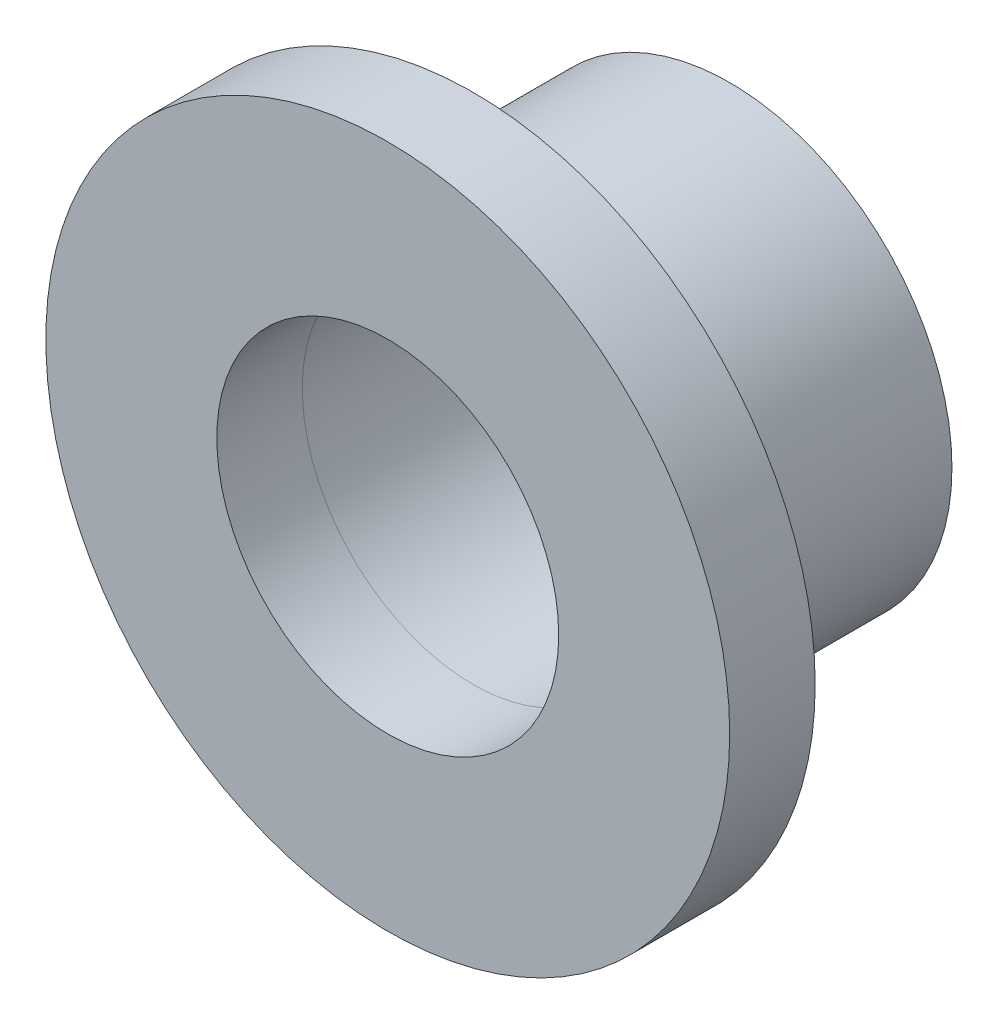
ISO-10303-21;
HEADER;
FILE_DESCRIPTION(('STEP AP214'),'2;1');
FILE_NAME('part.step','',(''),(''),'','','');
FILE_SCHEMA(('AUTOMOTIVE_DESIGN { 1 0 10303 214 1 1 1 1 }'));
ENDSEC;
DATA;
#1=APPLICATION_CONTEXT('core data for automotive mechanical design processes');
#2=APPLICATION_PROTOCOL_DEFINITION('international standard','automotive_design',2000,#1);
#3=PRODUCT_CONTEXT('',#1,'mechanical');
#4=PRODUCT('Part','Part','',(#3));
#5=PRODUCT_RELATED_PRODUCT_CATEGORY('part','',(#4));
#6=PRODUCT_DEFINITION_FORMATION('','',#4);
#7=PRODUCT_DEFINITION_CONTEXT('part definition',#1,'design');
#8=PRODUCT_DEFINITION('design','',#6,#7);
#9=PRODUCT_DEFINITION_SHAPE('','',#8);
#10=(LENGTH_UNIT() NAMED_UNIT(*) SI_UNIT(.MILLI.,.METRE.));
#11=(NAMED_UNIT(*) PLANE_ANGLE_UNIT() SI_UNIT($,.RADIAN.));
#12=(NAMED_UNIT(*) SI_UNIT($,.STERADIAN.) SOLID_ANGLE_UNIT());
#13=UNCERTAINTY_MEASURE_WITH_UNIT(LENGTH_MEASURE(1.E-05),#10,'distance_accuracy_value','');
#14=(GEOMETRIC_REPRESENTATION_CONTEXT(3) GLOBAL_UNCERTAINTY_ASSIGNED_CONTEXT((#13)) GLOBAL_UNIT_ASSIGNED_CONTEXT((#10,
#11,#12)) REPRESENTATION_CONTEXT('',''));
#15=CARTESIAN_POINT('',(0.,0.,0.));
#16=DIRECTION('',(0.,0.,1.));
#17=DIRECTION('',(1.,0.,0.));
#18=AXIS2_PLACEMENT_3D('',#15,#16,#17);
#19=CARTESIAN_POINT('',(0.,0.,20.));
#20=DIRECTION('',(0.,0.,1.));
#21=DIRECTION('',(1.,0.,0.));
#22=AXIS2_PLACEMENT_3D('',#19,#20,#21);
#23=PLANE('',#22);
#24=CARTESIAN_POINT('',(0.,0.,20.));
#25=DIRECTION('',(0.,0.,1.));
#26=DIRECTION('',(1.,0.,0.));
#27=AXIS2_PLACEMENT_3D('',#24,#25,#26);
#28=CIRCLE('',#27,20.);
#29=CARTESIAN_POINT('',(20.,0.,20.));
#30=VERTEX_POINT('',#29);
#31=EDGE_CURVE('E11',#30,#30,#28,.T.);
#32=ORIENTED_EDGE('',*,*,#31,.T.);
#33=EDGE_LOOP('',(#32));
#34=FACE_BOUND('',#33,.T.);
#35=CARTESIAN_POINT('',(0.,0.,20.));
#36=DIRECTION('',(0.,0.,1.));
#37=DIRECTION('',(1.,0.,0.));
#38=AXIS2_PLACEMENT_3D('',#35,#36,#37);
#39=CIRCLE('',#38,10.);
#40=CARTESIAN_POINT('',(10.,0.,20.));
#41=VERTEX_POINT('',#40);
#42=EDGE_CURVE('E51',#41,#41,#39,.T.);
#43=ORIENTED_EDGE('',*,*,#42,.F.);
#44=EDGE_LOOP('',(#43));
#45=FACE_BOUND('',#44,.T.);
#46=ADVANCED_FACE('F40',(#34,#45),#23,.T.);
#47=CARTESIAN_POINT('',(0.,0.,15.));
#48=DIRECTION('',(0.,0.,1.));
#49=DIRECTION('',(1.,0.,0.));
#50=AXIS2_PLACEMENT_3D('',#47,#48,#49);
#51=PLANE('',#50);
#52=CARTESIAN_POINT('',(0.,0.,15.));
#53=DIRECTION('',(0.,0.,1.));
#54=DIRECTION('',(1.,0.,0.));
#55=AXIS2_PLACEMENT_3D('',#52,#53,#54);
#56=CIRCLE('',#55,20.);
#57=CARTESIAN_POINT('',(20.,0.,15.));
#58=VERTEX_POINT('',#57);
#59=EDGE_CURVE('E44',#58,#58,#56,.T.);
#60=ORIENTED_EDGE('',*,*,#59,.F.);
#61=EDGE_LOOP('',(#60));
#62=FACE_BOUND('',#61,.T.);
#63=CARTESIAN_POINT('',(0.,0.,15.));
#64=DIRECTION('',(0.,0.,1.));
#65=DIRECTION('',(1.,0.,0.));
#66=AXIS2_PLACEMENT_3D('',#63,#64,#65);
#67=CIRCLE('',#66,10.);
#68=CARTESIAN_POINT('',(10.,0.,15.));
#69=VERTEX_POINT('',#68);
#70=EDGE_CURVE('E53',#69,#69,#67,.T.);
#71=ORIENTED_EDGE('',*,*,#70,.T.);
#72=EDGE_LOOP('',(#71));
#73=FACE_BOUND('',#72,.T.);
#74=ADVANCED_FACE('F63',(#62,#73),#51,.F.);
#75=CARTESIAN_POINT('',(0.,0.,20.));
#76=DIRECTION('',(0.,0.,-1.));
#77=DIRECTION('',(-1.,0.,0.));
#78=AXIS2_PLACEMENT_3D('',#75,#76,#77);
#79=CYLINDRICAL_SURFACE('',#78,20.);
#80=ORIENTED_EDGE('',*,*,#31,.F.);
#81=EDGE_LOOP('',(#80));
#82=FACE_BOUND('',#81,.T.);
#83=ORIENTED_EDGE('',*,*,#59,.T.);
#84=EDGE_LOOP('',(#83));
#85=FACE_BOUND('',#84,.T.);
#86=ADVANCED_FACE('F42',(#82,#85),#79,.T.);
#87=CARTESIAN_POINT('',(0.,0.,20.));
#88=DIRECTION('',(0.,0.,-1.));
#89=DIRECTION('',(-1.,0.,0.));
#90=AXIS2_PLACEMENT_3D('',#87,#88,#89);
#91=CYLINDRICAL_SURFACE('',#90,10.);
#92=ORIENTED_EDGE('',*,*,#42,.T.);
#93=EDGE_LOOP('',(#92));
#94=FACE_BOUND('',#93,.T.);
#95=ORIENTED_EDGE('',*,*,#70,.F.);
#96=EDGE_LOOP('',(#95));
#97=FACE_BOUND('',#96,.T.);
#98=ADVANCED_FACE('F59',(#94,#97),#91,.F.);
#99=CLOSED_SHELL('',(#46,#74,#86,#98));
#100=MANIFOLD_SOLID_BREP('B2',#99);
#101=CARTESIAN_POINT('',(0.,0.,15.));
#102=DIRECTION('',(0.,0.,1.));
#103=DIRECTION('',(1.,0.,0.));
#104=AXIS2_PLACEMENT_3D('',#101,#102,#103);
#105=PLANE('',#104);
#106=CARTESIAN_POINT('',(0.,0.,15.));
#107=DIRECTION('',(0.,0.,1.));
#108=DIRECTION('',(1.,0.,0.));
#109=AXIS2_PLACEMENT_3D('',#106,#107,#108);
#110=CIRCLE('',#109,13.);
#111=CARTESIAN_POINT('',(13.,0.,15.));
#112=VERTEX_POINT('',#111);
#113=EDGE_CURVE('E39',#112,#112,#110,.T.);
#114=ORIENTED_EDGE('',*,*,#113,.T.);
#115=EDGE_LOOP('',(#114));
#116=FACE_BOUND('',#115,.T.);
#117=CARTESIAN_POINT('',(0.,0.,15.));
#118=DIRECTION('',(0.,0.,1.));
#119=DIRECTION('',(1.,0.,0.));
#120=AXIS2_PLACEMENT_3D('',#117,#118,#119);
#121=CIRCLE('',#120,10.);
#122=CARTESIAN_POINT('',(10.,0.,15.));
#123=VERTEX_POINT('',#122);
#124=EDGE_CURVE('E112',#123,#123,#121,.T.);
#125=ORIENTED_EDGE('',*,*,#124,.F.);
#126=EDGE_LOOP('',(#125));
#127=FACE_BOUND('',#126,.T.);
#128=ADVANCED_FACE('F101',(#116,#127),#105,.T.);
#129=CARTESIAN_POINT('',(0.,0.,0.));
#130=DIRECTION('',(0.,0.,1.));
#131=DIRECTION('',(1.,0.,0.));
#132=AXIS2_PLACEMENT_3D('',#129,#130,#131);
#133=PLANE('',#132);
#134=CARTESIAN_POINT('',(0.,0.,0.));
#135=DIRECTION('',(0.,0.,1.));
#136=DIRECTION('',(1.,0.,0.));
#137=AXIS2_PLACEMENT_3D('',#134,#135,#136);
#138=CIRCLE('',#137,13.);
#139=CARTESIAN_POINT('',(13.,0.,0.));
#140=VERTEX_POINT('',#139);
#141=EDGE_CURVE('E105',#140,#140,#138,.T.);
#142=ORIENTED_EDGE('',*,*,#141,.F.);
#143=EDGE_LOOP('',(#142));
#144=FACE_BOUND('',#143,.T.);
#145=CARTESIAN_POINT('',(0.,0.,0.));
#146=DIRECTION('',(0.,0.,1.));
#147=DIRECTION('',(1.,0.,0.));
#148=AXIS2_PLACEMENT_3D('',#145,#146,#147);
#149=CIRCLE('',#148,10.);
#150=CARTESIAN_POINT('',(10.,0.,0.));
#151=VERTEX_POINT('',#150);
#152=EDGE_CURVE('E114',#151,#151,#149,.T.);
#153=ORIENTED_EDGE('',*,*,#152,.T.);
#154=EDGE_LOOP('',(#153));
#155=FACE_BOUND('',#154,.T.);
#156=ADVANCED_FACE('F124',(#144,#155),#133,.F.);
#157=CARTESIAN_POINT('',(0.,0.,15.));
#158=DIRECTION('',(0.,0.,-1.));
#159=DIRECTION('',(-1.,0.,0.));
#160=AXIS2_PLACEMENT_3D('',#157,#158,#159);
#161=CYLINDRICAL_SURFACE('',#160,13.);
#162=ORIENTED_EDGE('',*,*,#113,.F.);
#163=EDGE_LOOP('',(#162));
#164=FACE_BOUND('',#163,.T.);
#165=ORIENTED_EDGE('',*,*,#141,.T.);
#166=EDGE_LOOP('',(#165));
#167=FACE_BOUND('',#166,.T.);
#168=ADVANCED_FACE('F103',(#164,#167),#161,.T.);
#169=CARTESIAN_POINT('',(0.,0.,15.));
#170=DIRECTION('',(0.,0.,-1.));
#171=DIRECTION('',(-1.,0.,0.));
#172=AXIS2_PLACEMENT_3D('',#169,#170,#171);
#173=CYLINDRICAL_SURFACE('',#172,10.);
#174=ORIENTED_EDGE('',*,*,#124,.T.);
#175=EDGE_LOOP('',(#174));
#176=FACE_BOUND('',#175,.T.);
#177=ORIENTED_EDGE('',*,*,#152,.F.);
#178=EDGE_LOOP('',(#177));
#179=FACE_BOUND('',#178,.T.);
#180=ADVANCED_FACE('F120',(#176,#179),#173,.F.);
#181=CLOSED_SHELL('',(#128,#156,#168,#180));
#182=MANIFOLD_SOLID_BREP('B6',#181);
#183=ADVANCED_BREP_SHAPE_REPRESENTATION('',(#18,#100,#182),#14);
#184=SHAPE_DEFINITION_REPRESENTATION(#9,#183);
ENDSEC;
END-ISO-10303-21;
